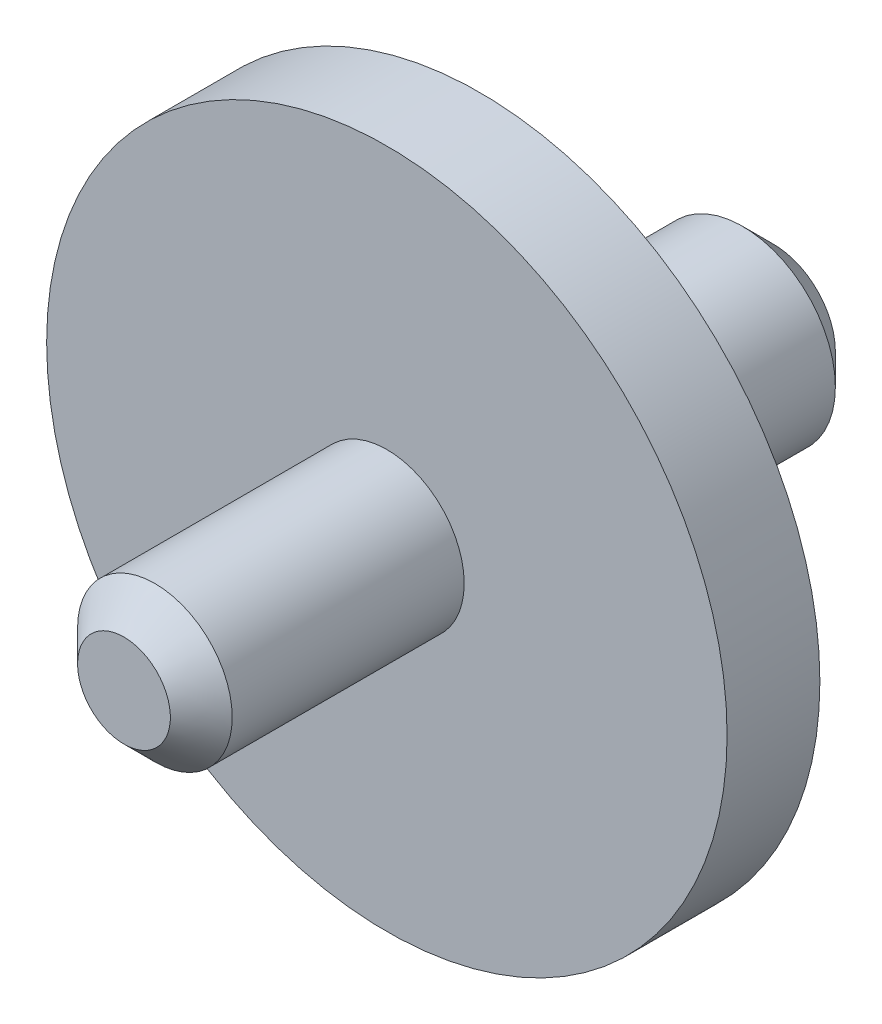
ISO-10303-21;
HEADER;
FILE_DESCRIPTION(('STEP AP214'),'2;1');
FILE_NAME('part.step','',(''),(''),'','','');
FILE_SCHEMA(('AUTOMOTIVE_DESIGN { 1 0 10303 214 1 1 1 1 }'));
ENDSEC;
DATA;
#1=APPLICATION_CONTEXT('core data for automotive mechanical design processes');
#2=APPLICATION_PROTOCOL_DEFINITION('international standard','automotive_design',2000,#1);
#3=PRODUCT_CONTEXT('',#1,'mechanical');
#4=PRODUCT('Part','Part','',(#3));
#5=PRODUCT_RELATED_PRODUCT_CATEGORY('part','',(#4));
#6=PRODUCT_DEFINITION_FORMATION('','',#4);
#7=PRODUCT_DEFINITION_CONTEXT('part definition',#1,'design');
#8=PRODUCT_DEFINITION('design','',#6,#7);
#9=PRODUCT_DEFINITION_SHAPE('','',#8);
#10=(LENGTH_UNIT() NAMED_UNIT(*) SI_UNIT(.MILLI.,.METRE.));
#11=(NAMED_UNIT(*) PLANE_ANGLE_UNIT() SI_UNIT($,.RADIAN.));
#12=(NAMED_UNIT(*) SI_UNIT($,.STERADIAN.) SOLID_ANGLE_UNIT());
#13=UNCERTAINTY_MEASURE_WITH_UNIT(LENGTH_MEASURE(1.E-05),#10,'distance_accuracy_value','');
#14=(GEOMETRIC_REPRESENTATION_CONTEXT(3) GLOBAL_UNCERTAINTY_ASSIGNED_CONTEXT((#13)) GLOBAL_UNIT_ASSIGNED_CONTEXT((#10,
#11,#12)) REPRESENTATION_CONTEXT('',''));
#15=CARTESIAN_POINT('',(0.,0.,0.));
#16=DIRECTION('',(0.,0.,1.));
#17=DIRECTION('',(1.,0.,0.));
#18=AXIS2_PLACEMENT_3D('',#15,#16,#17);
#19=CARTESIAN_POINT('',(0.,0.,0.));
#20=DIRECTION('',(0.,0.,-1.));
#21=DIRECTION('',(-1.,0.,0.));
#22=AXIS2_PLACEMENT_3D('',#19,#20,#21);
#23=PLANE('',#22);
#24=CARTESIAN_POINT('',(0.,0.,0.));
#25=DIRECTION('',(0.,0.,-1.));
#26=DIRECTION('',(-1.,0.,0.));
#27=AXIS2_PLACEMENT_3D('',#24,#25,#26);
#28=CIRCLE('',#27,1.5);
#29=CARTESIAN_POINT('',(-1.5,0.,0.));
#30=VERTEX_POINT('',#29);
#31=EDGE_CURVE('E73',#30,#30,#28,.F.);
#32=ORIENTED_EDGE('',*,*,#31,.T.);
#33=EDGE_LOOP('',(#32));
#34=FACE_BOUND('',#33,.T.);
#35=ADVANCED_FACE('F54',(#34),#23,.F.);
#36=CARTESIAN_POINT('',(0.,0.,41.6194995462207));
#37=DIRECTION('',(0.,0.,1.));
#38=DIRECTION('',(1.,0.,0.));
#39=AXIS2_PLACEMENT_3D('',#36,#37,#38);
#40=CYLINDRICAL_SURFACE('',#39,2.5);
#41=CARTESIAN_POINT('',(0.,0.,-1.));
#42=DIRECTION('',(0.,0.,-1.));
#43=DIRECTION('',(-1.,0.,0.));
#44=AXIS2_PLACEMENT_3D('',#41,#42,#43);
#45=CIRCLE('',#44,2.5);
#46=CARTESIAN_POINT('',(-2.5,0.,-1.));
#47=VERTEX_POINT('',#46);
#48=EDGE_CURVE('E68',#47,#47,#45,.T.);
#49=ORIENTED_EDGE('',*,*,#48,.T.);
#50=EDGE_LOOP('',(#49));
#51=FACE_BOUND('',#50,.T.);
#52=CARTESIAN_POINT('',(0.,0.,-8.5));
#53=DIRECTION('',(0.,0.,1.));
#54=DIRECTION('',(1.,0.,0.));
#55=AXIS2_PLACEMENT_3D('',#52,#53,#54);
#56=CIRCLE('',#55,2.5);
#57=CARTESIAN_POINT('',(2.5,0.,-8.5));
#58=VERTEX_POINT('',#57);
#59=EDGE_CURVE('E79',#58,#58,#56,.T.);
#60=ORIENTED_EDGE('',*,*,#59,.T.);
#61=EDGE_LOOP('',(#60));
#62=FACE_BOUND('',#61,.T.);
#63=ADVANCED_FACE('F120',(#51,#62),#40,.T.);
#64=CARTESIAN_POINT('',(0.,2.5,-8.5));
#65=DIRECTION('',(0.,0.,-1.));
#66=DIRECTION('',(-1.,0.,0.));
#67=AXIS2_PLACEMENT_3D('',#64,#65,#66);
#68=PLANE('',#67);
#69=ORIENTED_EDGE('',*,*,#59,.F.);
#70=EDGE_LOOP('',(#69));
#71=FACE_BOUND('',#70,.T.);
#72=CARTESIAN_POINT('',(0.,0.,-8.5));
#73=DIRECTION('',(0.,0.,1.));
#74=DIRECTION('',(1.,0.,0.));
#75=AXIS2_PLACEMENT_3D('',#72,#73,#74);
#76=CIRCLE('',#75,11.);
#77=CARTESIAN_POINT('',(11.,0.,-8.5));
#78=VERTEX_POINT('',#77);
#79=EDGE_CURVE('E83',#78,#78,#76,.T.);
#80=ORIENTED_EDGE('',*,*,#79,.T.);
#81=EDGE_LOOP('',(#80));
#82=FACE_BOUND('',#81,.T.);
#83=ADVANCED_FACE('F126',(#71,#82),#68,.F.);
#84=CARTESIAN_POINT('',(0.,0.,41.6194995462207));
#85=DIRECTION('',(0.,0.,1.));
#86=DIRECTION('',(1.,0.,0.));
#87=AXIS2_PLACEMENT_3D('',#84,#85,#86);
#88=CYLINDRICAL_SURFACE('',#87,11.);
#89=ORIENTED_EDGE('',*,*,#79,.F.);
#90=EDGE_LOOP('',(#89));
#91=FACE_BOUND('',#90,.T.);
#92=CARTESIAN_POINT('',(0.,0.,-11.5));
#93=DIRECTION('',(0.,0.,1.));
#94=DIRECTION('',(1.,0.,0.));
#95=AXIS2_PLACEMENT_3D('',#92,#93,#94);
#96=CIRCLE('',#95,11.);
#97=CARTESIAN_POINT('',(11.,0.,-11.5));
#98=VERTEX_POINT('',#97);
#99=EDGE_CURVE('E87',#98,#98,#96,.T.);
#100=ORIENTED_EDGE('',*,*,#99,.T.);
#101=EDGE_LOOP('',(#100));
#102=FACE_BOUND('',#101,.T.);
#103=ADVANCED_FACE('F147',(#91,#102),#88,.T.);
#104=CARTESIAN_POINT('',(0.,11.,-11.5));
#105=DIRECTION('',(0.,0.,1.));
#106=DIRECTION('',(1.,0.,0.));
#107=AXIS2_PLACEMENT_3D('',#104,#105,#106);
#108=PLANE('',#107);
#109=ORIENTED_EDGE('',*,*,#99,.F.);
#110=EDGE_LOOP('',(#109));
#111=FACE_BOUND('',#110,.T.);
#112=CARTESIAN_POINT('',(0.,0.,-11.5));
#113=DIRECTION('',(0.,0.,1.));
#114=DIRECTION('',(1.,0.,0.));
#115=AXIS2_PLACEMENT_3D('',#112,#113,#114);
#116=CIRCLE('',#115,5.);
#117=CARTESIAN_POINT('',(5.,0.,-11.5));
#118=VERTEX_POINT('',#117);
#119=EDGE_CURVE('E91',#118,#118,#116,.T.);
#120=ORIENTED_EDGE('',*,*,#119,.T.);
#121=EDGE_LOOP('',(#120));
#122=FACE_BOUND('',#121,.T.);
#123=ADVANCED_FACE('F152',(#111,#122),#108,.F.);
#124=CARTESIAN_POINT('',(0.,0.,41.6194995462207));
#125=DIRECTION('',(0.,0.,1.));
#126=DIRECTION('',(1.,0.,0.));
#127=AXIS2_PLACEMENT_3D('',#124,#125,#126);
#128=CYLINDRICAL_SURFACE('',#127,5.);
#129=ORIENTED_EDGE('',*,*,#119,.F.);
#130=EDGE_LOOP('',(#129));
#131=FACE_BOUND('',#130,.T.);
#132=CARTESIAN_POINT('',(0.,0.,-15.5));
#133=DIRECTION('',(0.,0.,1.));
#134=DIRECTION('',(1.,0.,0.));
#135=AXIS2_PLACEMENT_3D('',#132,#133,#134);
#136=CIRCLE('',#135,5.);
#137=CARTESIAN_POINT('',(5.,0.,-15.5));
#138=VERTEX_POINT('',#137);
#139=EDGE_CURVE('E95',#138,#138,#136,.T.);
#140=ORIENTED_EDGE('',*,*,#139,.T.);
#141=EDGE_LOOP('',(#140));
#142=FACE_BOUND('',#141,.T.);
#143=ADVANCED_FACE('F116',(#131,#142),#128,.T.);
#144=CARTESIAN_POINT('',(0.,5.,-15.5));
#145=DIRECTION('',(0.,0.,1.));
#146=DIRECTION('',(1.,0.,0.));
#147=AXIS2_PLACEMENT_3D('',#144,#145,#146);
#148=PLANE('',#147);
#149=ORIENTED_EDGE('',*,*,#139,.F.);
#150=EDGE_LOOP('',(#149));
#151=FACE_BOUND('',#150,.T.);
#152=CARTESIAN_POINT('',(0.,0.,-15.5));
#153=DIRECTION('',(0.,0.,1.));
#154=DIRECTION('',(1.,0.,0.));
#155=AXIS2_PLACEMENT_3D('',#152,#153,#154);
#156=CIRCLE('',#155,3.);
#157=CARTESIAN_POINT('',(3.,0.,-15.5));
#158=VERTEX_POINT('',#157);
#159=EDGE_CURVE('E99',#158,#158,#156,.T.);
#160=ORIENTED_EDGE('',*,*,#159,.T.);
#161=EDGE_LOOP('',(#160));
#162=FACE_BOUND('',#161,.T.);
#163=ADVANCED_FACE('F104',(#151,#162),#148,.F.);
#164=CARTESIAN_POINT('',(0.,0.,41.6194995462207));
#165=DIRECTION('',(0.,0.,1.));
#166=DIRECTION('',(1.,0.,0.));
#167=AXIS2_PLACEMENT_3D('',#164,#165,#166);
#168=CYLINDRICAL_SURFACE('',#167,3.);
#169=CARTESIAN_POINT('',(0.,0.,-20.));
#170=DIRECTION('',(0.,0.,1.));
#171=DIRECTION('',(1.,0.,0.));
#172=AXIS2_PLACEMENT_3D('',#169,#170,#171);
#173=CIRCLE('',#172,3.);
#174=CARTESIAN_POINT('',(3.,0.,-20.));
#175=VERTEX_POINT('',#174);
#176=EDGE_CURVE('E63',#175,#175,#173,.T.);
#177=ORIENTED_EDGE('',*,*,#176,.T.);
#178=EDGE_LOOP('',(#177));
#179=FACE_BOUND('',#178,.T.);
#180=ORIENTED_EDGE('',*,*,#159,.F.);
#181=EDGE_LOOP('',(#180));
#182=FACE_BOUND('',#181,.T.);
#183=ADVANCED_FACE('F106',(#179,#182),#168,.T.);
#184=CARTESIAN_POINT('',(0.,3.,-21.));
#185=DIRECTION('',(0.,0.,1.));
#186=DIRECTION('',(1.,0.,0.));
#187=AXIS2_PLACEMENT_3D('',#184,#185,#186);
#188=PLANE('',#187);
#189=CARTESIAN_POINT('',(0.,0.,-21.));
#190=DIRECTION('',(0.,0.,1.));
#191=DIRECTION('',(1.,0.,0.));
#192=AXIS2_PLACEMENT_3D('',#189,#190,#191);
#193=CIRCLE('',#192,1.99999999999997);
#194=CARTESIAN_POINT('',(1.99999999999997,0.,-21.));
#195=VERTEX_POINT('',#194);
#196=EDGE_CURVE('E12',#195,#195,#193,.F.);
#197=ORIENTED_EDGE('',*,*,#196,.T.);
#198=EDGE_LOOP('',(#197));
#199=FACE_BOUND('',#198,.T.);
#200=ADVANCED_FACE('F108',(#199),#188,.F.);
#201=CARTESIAN_POINT('',(0.,0.,0.));
#202=DIRECTION('',(0.,0.,-1.));
#203=DIRECTION('',(-1.,0.,0.));
#204=AXIS2_PLACEMENT_3D('',#201,#202,#203);
#205=CONICAL_SURFACE('',#204,1.5,0.785398163397447);
#206=ORIENTED_EDGE('',*,*,#48,.F.);
#207=EDGE_LOOP('',(#206));
#208=FACE_BOUND('',#207,.T.);
#209=ORIENTED_EDGE('',*,*,#31,.F.);
#210=EDGE_LOOP('',(#209));
#211=FACE_BOUND('',#210,.T.);
#212=ADVANCED_FACE('F114',(#208,#211),#205,.T.);
#213=CARTESIAN_POINT('',(0.,0.,-20.));
#214=DIRECTION('',(0.,0.,1.));
#215=DIRECTION('',(1.,0.,0.));
#216=AXIS2_PLACEMENT_3D('',#213,#214,#215);
#217=CONICAL_SURFACE('',#216,3.,0.785398163397452);
#218=ORIENTED_EDGE('',*,*,#196,.F.);
#219=EDGE_LOOP('',(#218));
#220=FACE_BOUND('',#219,.T.);
#221=ORIENTED_EDGE('',*,*,#176,.F.);
#222=EDGE_LOOP('',(#221));
#223=FACE_BOUND('',#222,.T.);
#224=ADVANCED_FACE('F57',(#220,#223),#217,.T.);
#225=CLOSED_SHELL('',(#35,#63,#83,#103,#123,#143,#163,#183,#200,#212,#224));
#226=MANIFOLD_SOLID_BREP('B2',#225);
#227=ADVANCED_BREP_SHAPE_REPRESENTATION('',(#18,#226),#14);
#228=SHAPE_DEFINITION_REPRESENTATION(#9,#227);
ENDSEC;
END-ISO-10303-21;
